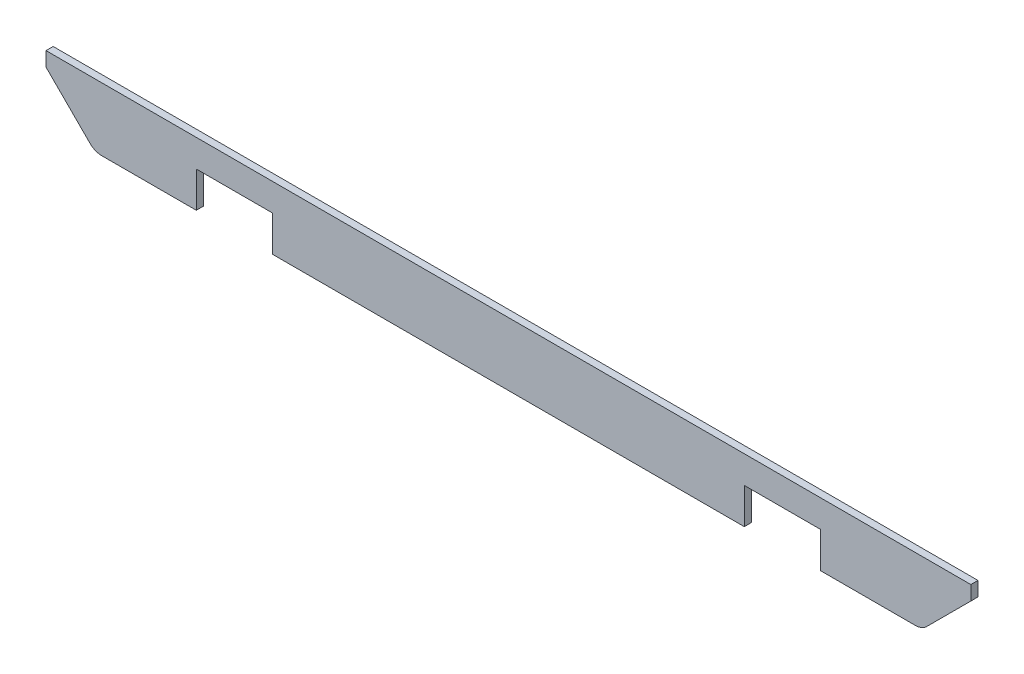
ISO-10303-21;
HEADER;
FILE_DESCRIPTION(('STEP AP214'),'2;1');
FILE_NAME('part.step','',(''),(''),'','','');
FILE_SCHEMA(('AUTOMOTIVE_DESIGN { 1 0 10303 214 1 1 1 1 }'));
ENDSEC;
DATA;
#1=APPLICATION_CONTEXT('core data for automotive mechanical design processes');
#2=APPLICATION_PROTOCOL_DEFINITION('international standard','automotive_design',2000,#1);
#3=PRODUCT_CONTEXT('',#1,'mechanical');
#4=PRODUCT('Part','Part','',(#3));
#5=PRODUCT_RELATED_PRODUCT_CATEGORY('part','',(#4));
#6=PRODUCT_DEFINITION_FORMATION('','',#4);
#7=PRODUCT_DEFINITION_CONTEXT('part definition',#1,'design');
#8=PRODUCT_DEFINITION('design','',#6,#7);
#9=PRODUCT_DEFINITION_SHAPE('','',#8);
#10=(LENGTH_UNIT() NAMED_UNIT(*) SI_UNIT(.MILLI.,.METRE.));
#11=(NAMED_UNIT(*) PLANE_ANGLE_UNIT() SI_UNIT($,.RADIAN.));
#12=(NAMED_UNIT(*) SI_UNIT($,.STERADIAN.) SOLID_ANGLE_UNIT());
#13=UNCERTAINTY_MEASURE_WITH_UNIT(LENGTH_MEASURE(1.E-05),#10,'distance_accuracy_value','');
#14=(GEOMETRIC_REPRESENTATION_CONTEXT(3) GLOBAL_UNCERTAINTY_ASSIGNED_CONTEXT((#13)) GLOBAL_UNIT_ASSIGNED_CONTEXT((#10,
#11,#12)) REPRESENTATION_CONTEXT('',''));
#15=CARTESIAN_POINT('',(0.,0.,0.));
#16=DIRECTION('',(0.,0.,1.));
#17=DIRECTION('',(1.,0.,0.));
#18=AXIS2_PLACEMENT_3D('',#15,#16,#17);
#19=CARTESIAN_POINT('',(-170.604099117637,-19.5020709287023,3.));
#20=DIRECTION('',(0.,0.,-1.));
#21=DIRECTION('',(-1.,0.,0.));
#22=AXIS2_PLACEMENT_3D('',#19,#20,#21);
#23=CYLINDRICAL_SURFACE('',#22,7.00000000000001);
#24=CARTESIAN_POINT('',(-170.604099117637,-19.5020709287023,0.));
#25=DIRECTION('',(0.,0.,1.));
#26=DIRECTION('',(1.,0.,0.));
#27=AXIS2_PLACEMENT_3D('',#24,#25,#26);
#28=CIRCLE('',#27,7.00000000000001);
#29=CARTESIAN_POINT('',(-170.433838396722,-26.5,0.));
#30=VERTEX_POINT('',#29);
#31=CARTESIAN_POINT('',(-175.383585865028,-24.6164141349722,0.));
#32=VERTEX_POINT('',#31);
#33=EDGE_CURVE('E177',#30,#32,#28,.F.);
#34=ORIENTED_EDGE('',*,*,#33,.F.);
#35=DIRECTION('',(0.,0.,-1.));
#36=VECTOR('',#35,1.);
#37=CARTESIAN_POINT('',(-170.433838396722,-26.5,3.));
#38=LINE('',#37,#36);
#39=CARTESIAN_POINT('',(-170.433838396722,-26.5,3.));
#40=VERTEX_POINT('',#39);
#41=EDGE_CURVE('E11',#40,#30,#38,.T.);
#42=ORIENTED_EDGE('',*,*,#41,.F.);
#43=CARTESIAN_POINT('',(-170.604099117637,-19.5020709287023,3.));
#44=DIRECTION('',(0.,0.,1.));
#45=DIRECTION('',(1.,0.,0.));
#46=AXIS2_PLACEMENT_3D('',#43,#44,#45);
#47=CIRCLE('',#46,7.00000000000001);
#48=CARTESIAN_POINT('',(-175.383585865028,-24.6164141349722,3.));
#49=VERTEX_POINT('',#48);
#50=EDGE_CURVE('E217',#40,#49,#47,.F.);
#51=ORIENTED_EDGE('',*,*,#50,.T.);
#52=DIRECTION('',(0.,0.,-1.));
#53=VECTOR('',#52,1.);
#54=CARTESIAN_POINT('',(-175.383585865028,-24.6164141349722,3.));
#55=LINE('',#54,#53);
#56=EDGE_CURVE('E109',#49,#32,#55,.T.);
#57=ORIENTED_EDGE('',*,*,#56,.T.);
#58=EDGE_LOOP('',(#34,#42,#51,#57));
#59=FACE_BOUND('',#58,.T.);
#60=ADVANCED_FACE('F35',(#59),#23,.T.);
#61=CARTESIAN_POINT('',(0.,-26.5,3.));
#62=DIRECTION('',(0.,-1.,0.));
#63=DIRECTION('',(1.,0.,0.));
#64=AXIS2_PLACEMENT_3D('',#61,#62,#63);
#65=PLANE('',#64);
#66=DIRECTION('',(-1.,0.,0.));
#67=VECTOR('',#66,1.);
#68=CARTESIAN_POINT('',(0.,-26.5,0.));
#69=LINE('',#68,#67);
#70=CARTESIAN_POINT('',(-130.955345629466,-26.5,0.));
#71=VERTEX_POINT('',#70);
#72=EDGE_CURVE('E180',#71,#30,#69,.T.);
#73=ORIENTED_EDGE('',*,*,#72,.F.);
#74=DIRECTION('',(0.,0.,-1.));
#75=VECTOR('',#74,1.);
#76=CARTESIAN_POINT('',(-130.955345629466,-26.5,3.));
#77=LINE('',#76,#75);
#78=CARTESIAN_POINT('',(-130.955345629466,-26.5,3.));
#79=VERTEX_POINT('',#78);
#80=EDGE_CURVE('E43',#79,#71,#77,.T.);
#81=ORIENTED_EDGE('',*,*,#80,.F.);
#82=DIRECTION('',(-1.,0.,0.));
#83=VECTOR('',#82,1.);
#84=CARTESIAN_POINT('',(0.,-26.5,3.));
#85=LINE('',#84,#83);
#86=EDGE_CURVE('E257',#79,#40,#85,.T.);
#87=ORIENTED_EDGE('',*,*,#86,.T.);
#88=ORIENTED_EDGE('',*,*,#41,.T.);
#89=EDGE_LOOP('',(#73,#81,#87,#88));
#90=FACE_BOUND('',#89,.T.);
#91=ADVANCED_FACE('F256',(#90),#65,.T.);
#92=CARTESIAN_POINT('',(-130.955345629466,0.,3.));
#93=DIRECTION('',(-1.,0.,0.));
#94=DIRECTION('',(0.,0.,1.));
#95=AXIS2_PLACEMENT_3D('',#92,#93,#94);
#96=PLANE('',#95);
#97=DIRECTION('',(0.,1.,0.));
#98=VECTOR('',#97,1.);
#99=CARTESIAN_POINT('',(-130.955345629466,0.,0.));
#100=LINE('',#99,#98);
#101=CARTESIAN_POINT('',(-130.955345629466,-11.5,0.));
#102=VERTEX_POINT('',#101);
#103=EDGE_CURVE('E183',#71,#102,#100,.T.);
#104=ORIENTED_EDGE('',*,*,#103,.T.);
#105=DIRECTION('',(0.,0.,-1.));
#106=VECTOR('',#105,1.);
#107=CARTESIAN_POINT('',(-130.955345629466,-11.5,3.));
#108=LINE('',#107,#106);
#109=CARTESIAN_POINT('',(-130.955345629466,-11.5,3.));
#110=VERTEX_POINT('',#109);
#111=EDGE_CURVE('E242',#110,#102,#108,.T.);
#112=ORIENTED_EDGE('',*,*,#111,.F.);
#113=DIRECTION('',(0.,1.,0.));
#114=VECTOR('',#113,1.);
#115=CARTESIAN_POINT('',(-130.955345629466,0.,3.));
#116=LINE('',#115,#114);
#117=EDGE_CURVE('E248',#79,#110,#116,.T.);
#118=ORIENTED_EDGE('',*,*,#117,.F.);
#119=ORIENTED_EDGE('',*,*,#80,.T.);
#120=EDGE_LOOP('',(#104,#112,#118,#119));
#121=FACE_BOUND('',#120,.T.);
#122=ADVANCED_FACE('F246',(#121),#96,.F.);
#123=CARTESIAN_POINT('',(0.,-11.5,3.));
#124=DIRECTION('',(0.,-1.,0.));
#125=DIRECTION('',(0.,0.,-1.));
#126=AXIS2_PLACEMENT_3D('',#123,#124,#125);
#127=PLANE('',#126);
#128=DIRECTION('',(-1.,0.,0.));
#129=VECTOR('',#128,1.);
#130=CARTESIAN_POINT('',(0.,-11.5,0.));
#131=LINE('',#130,#129);
#132=CARTESIAN_POINT('',(-98.9553456294655,-11.5,0.));
#133=VERTEX_POINT('',#132);
#134=EDGE_CURVE('E186',#133,#102,#131,.T.);
#135=ORIENTED_EDGE('',*,*,#134,.F.);
#136=DIRECTION('',(0.,0.,-1.));
#137=VECTOR('',#136,1.);
#138=CARTESIAN_POINT('',(-98.9553456294655,-11.5,3.));
#139=LINE('',#138,#137);
#140=CARTESIAN_POINT('',(-98.9553456294655,-11.5,3.));
#141=VERTEX_POINT('',#140);
#142=EDGE_CURVE('E240',#141,#133,#139,.T.);
#143=ORIENTED_EDGE('',*,*,#142,.F.);
#144=DIRECTION('',(-1.,0.,0.));
#145=VECTOR('',#144,1.);
#146=CARTESIAN_POINT('',(0.,-11.5,3.));
#147=LINE('',#146,#145);
#148=EDGE_CURVE('E263',#141,#110,#147,.T.);
#149=ORIENTED_EDGE('',*,*,#148,.T.);
#150=ORIENTED_EDGE('',*,*,#111,.T.);
#151=EDGE_LOOP('',(#135,#143,#149,#150));
#152=FACE_BOUND('',#151,.T.);
#153=ADVANCED_FACE('F314',(#152),#127,.T.);
#154=CARTESIAN_POINT('',(-98.9553456294655,0.,3.));
#155=DIRECTION('',(-1.,0.,0.));
#156=DIRECTION('',(0.,0.,1.));
#157=AXIS2_PLACEMENT_3D('',#154,#155,#156);
#158=PLANE('',#157);
#159=DIRECTION('',(0.,1.,0.));
#160=VECTOR('',#159,1.);
#161=CARTESIAN_POINT('',(-98.9553456294655,0.,0.));
#162=LINE('',#161,#160);
#163=CARTESIAN_POINT('',(-98.9553456294655,-26.5,0.));
#164=VERTEX_POINT('',#163);
#165=EDGE_CURVE('E189',#164,#133,#162,.T.);
#166=ORIENTED_EDGE('',*,*,#165,.F.);
#167=DIRECTION('',(0.,0.,-1.));
#168=VECTOR('',#167,1.);
#169=CARTESIAN_POINT('',(-98.9553456294655,-26.5,3.));
#170=LINE('',#169,#168);
#171=CARTESIAN_POINT('',(-98.9553456294655,-26.5,3.));
#172=VERTEX_POINT('',#171);
#173=EDGE_CURVE('E238',#172,#164,#170,.T.);
#174=ORIENTED_EDGE('',*,*,#173,.F.);
#175=DIRECTION('',(0.,1.,0.));
#176=VECTOR('',#175,1.);
#177=CARTESIAN_POINT('',(-98.9553456294655,0.,3.));
#178=LINE('',#177,#176);
#179=EDGE_CURVE('E266',#172,#141,#178,.T.);
#180=ORIENTED_EDGE('',*,*,#179,.T.);
#181=ORIENTED_EDGE('',*,*,#142,.T.);
#182=EDGE_LOOP('',(#166,#174,#180,#181));
#183=FACE_BOUND('',#182,.T.);
#184=ADVANCED_FACE('F319',(#183),#158,.T.);
#185=CARTESIAN_POINT('',(0.,-26.5,3.));
#186=DIRECTION('',(0.,1.,0.));
#187=DIRECTION('',(0.,0.,1.));
#188=AXIS2_PLACEMENT_3D('',#185,#186,#187);
#189=PLANE('',#188);
#190=DIRECTION('',(1.,0.,0.));
#191=VECTOR('',#190,1.);
#192=CARTESIAN_POINT('',(0.,-26.5,0.));
#193=LINE('',#192,#191);
#194=CARTESIAN_POINT('',(98.9553456294655,-26.5,0.));
#195=VERTEX_POINT('',#194);
#196=EDGE_CURVE('E192',#164,#195,#193,.T.);
#197=ORIENTED_EDGE('',*,*,#196,.T.);
#198=DIRECTION('',(0.,0.,-1.));
#199=VECTOR('',#198,1.);
#200=CARTESIAN_POINT('',(98.9553456294655,-26.5,3.));
#201=LINE('',#200,#199);
#202=CARTESIAN_POINT('',(98.9553456294655,-26.5,3.));
#203=VERTEX_POINT('',#202);
#204=EDGE_CURVE('E235',#203,#195,#201,.T.);
#205=ORIENTED_EDGE('',*,*,#204,.F.);
#206=DIRECTION('',(1.,0.,0.));
#207=VECTOR('',#206,1.);
#208=CARTESIAN_POINT('',(0.,-26.5,3.));
#209=LINE('',#208,#207);
#210=EDGE_CURVE('E269',#172,#203,#209,.T.);
#211=ORIENTED_EDGE('',*,*,#210,.F.);
#212=ORIENTED_EDGE('',*,*,#173,.T.);
#213=EDGE_LOOP('',(#197,#205,#211,#212));
#214=FACE_BOUND('',#213,.T.);
#215=ADVANCED_FACE('F323',(#214),#189,.F.);
#216=CARTESIAN_POINT('',(98.9553456294655,0.,3.));
#217=DIRECTION('',(-1.,0.,0.));
#218=DIRECTION('',(0.,0.,1.));
#219=AXIS2_PLACEMENT_3D('',#216,#217,#218);
#220=PLANE('',#219);
#221=DIRECTION('',(0.,1.,0.));
#222=VECTOR('',#221,1.);
#223=CARTESIAN_POINT('',(98.9553456294655,0.,0.));
#224=LINE('',#223,#222);
#225=CARTESIAN_POINT('',(98.9553456294655,-11.5,0.));
#226=VERTEX_POINT('',#225);
#227=EDGE_CURVE('E194',#195,#226,#224,.T.);
#228=ORIENTED_EDGE('',*,*,#227,.T.);
#229=DIRECTION('',(0.,0.,-1.));
#230=VECTOR('',#229,1.);
#231=CARTESIAN_POINT('',(98.9553456294655,-11.5,3.));
#232=LINE('',#231,#230);
#233=CARTESIAN_POINT('',(98.9553456294655,-11.5,3.));
#234=VERTEX_POINT('',#233);
#235=EDGE_CURVE('E232',#234,#226,#232,.T.);
#236=ORIENTED_EDGE('',*,*,#235,.F.);
#237=DIRECTION('',(0.,1.,0.));
#238=VECTOR('',#237,1.);
#239=CARTESIAN_POINT('',(98.9553456294655,0.,3.));
#240=LINE('',#239,#238);
#241=EDGE_CURVE('E271',#203,#234,#240,.T.);
#242=ORIENTED_EDGE('',*,*,#241,.F.);
#243=ORIENTED_EDGE('',*,*,#204,.T.);
#244=EDGE_LOOP('',(#228,#236,#242,#243));
#245=FACE_BOUND('',#244,.T.);
#246=ADVANCED_FACE('F327',(#245),#220,.F.);
#247=CARTESIAN_POINT('',(0.,-11.5,3.));
#248=DIRECTION('',(0.,1.,0.));
#249=DIRECTION('',(0.,0.,1.));
#250=AXIS2_PLACEMENT_3D('',#247,#248,#249);
#251=PLANE('',#250);
#252=DIRECTION('',(1.,0.,0.));
#253=VECTOR('',#252,1.);
#254=CARTESIAN_POINT('',(0.,-11.5,0.));
#255=LINE('',#254,#253);
#256=CARTESIAN_POINT('',(130.955345629466,-11.5,0.));
#257=VERTEX_POINT('',#256);
#258=EDGE_CURVE('E196',#226,#257,#255,.T.);
#259=ORIENTED_EDGE('',*,*,#258,.T.);
#260=DIRECTION('',(0.,0.,-1.));
#261=VECTOR('',#260,1.);
#262=CARTESIAN_POINT('',(130.955345629466,-11.5,3.));
#263=LINE('',#262,#261);
#264=CARTESIAN_POINT('',(130.955345629466,-11.5,3.));
#265=VERTEX_POINT('',#264);
#266=EDGE_CURVE('E230',#265,#257,#263,.T.);
#267=ORIENTED_EDGE('',*,*,#266,.F.);
#268=DIRECTION('',(1.,0.,0.));
#269=VECTOR('',#268,1.);
#270=CARTESIAN_POINT('',(0.,-11.5,3.));
#271=LINE('',#270,#269);
#272=EDGE_CURVE('E273',#234,#265,#271,.T.);
#273=ORIENTED_EDGE('',*,*,#272,.F.);
#274=ORIENTED_EDGE('',*,*,#235,.T.);
#275=EDGE_LOOP('',(#259,#267,#273,#274));
#276=FACE_BOUND('',#275,.T.);
#277=ADVANCED_FACE('F331',(#276),#251,.F.);
#278=CARTESIAN_POINT('',(130.955345629466,0.,3.));
#279=DIRECTION('',(-1.,0.,0.));
#280=DIRECTION('',(0.,0.,1.));
#281=AXIS2_PLACEMENT_3D('',#278,#279,#280);
#282=PLANE('',#281);
#283=DIRECTION('',(0.,1.,0.));
#284=VECTOR('',#283,1.);
#285=CARTESIAN_POINT('',(130.955345629466,0.,0.));
#286=LINE('',#285,#284);
#287=CARTESIAN_POINT('',(130.955345629466,-26.5,0.));
#288=VERTEX_POINT('',#287);
#289=EDGE_CURVE('E199',#288,#257,#286,.T.);
#290=ORIENTED_EDGE('',*,*,#289,.F.);
#291=DIRECTION('',(0.,0.,-1.));
#292=VECTOR('',#291,1.);
#293=CARTESIAN_POINT('',(130.955345629466,-26.5,3.));
#294=LINE('',#293,#292);
#295=CARTESIAN_POINT('',(130.955345629466,-26.5,3.));
#296=VERTEX_POINT('',#295);
#297=EDGE_CURVE('E228',#296,#288,#294,.T.);
#298=ORIENTED_EDGE('',*,*,#297,.F.);
#299=DIRECTION('',(0.,1.,0.));
#300=VECTOR('',#299,1.);
#301=CARTESIAN_POINT('',(130.955345629466,0.,3.));
#302=LINE('',#301,#300);
#303=EDGE_CURVE('E275',#296,#265,#302,.T.);
#304=ORIENTED_EDGE('',*,*,#303,.T.);
#305=ORIENTED_EDGE('',*,*,#266,.T.);
#306=EDGE_LOOP('',(#290,#298,#304,#305));
#307=FACE_BOUND('',#306,.T.);
#308=ADVANCED_FACE('F335',(#307),#282,.T.);
#309=CARTESIAN_POINT('',(0.,-26.5,3.));
#310=DIRECTION('',(0.,1.,0.));
#311=DIRECTION('',(-1.,0.,0.));
#312=AXIS2_PLACEMENT_3D('',#309,#310,#311);
#313=PLANE('',#312);
#314=DIRECTION('',(1.,0.,0.));
#315=VECTOR('',#314,1.);
#316=CARTESIAN_POINT('',(0.,-26.5,0.));
#317=LINE('',#316,#315);
#318=CARTESIAN_POINT('',(170.433838396722,-26.5,0.));
#319=VERTEX_POINT('',#318);
#320=EDGE_CURVE('E202',#288,#319,#317,.T.);
#321=ORIENTED_EDGE('',*,*,#320,.T.);
#322=DIRECTION('',(0.,0.,-1.));
#323=VECTOR('',#322,1.);
#324=CARTESIAN_POINT('',(170.433838396722,-26.5,3.));
#325=LINE('',#324,#323);
#326=CARTESIAN_POINT('',(170.433838396722,-26.5,3.));
#327=VERTEX_POINT('',#326);
#328=EDGE_CURVE('E225',#327,#319,#325,.T.);
#329=ORIENTED_EDGE('',*,*,#328,.F.);
#330=DIRECTION('',(1.,0.,0.));
#331=VECTOR('',#330,1.);
#332=CARTESIAN_POINT('',(0.,-26.5,3.));
#333=LINE('',#332,#331);
#334=EDGE_CURVE('E278',#296,#327,#333,.T.);
#335=ORIENTED_EDGE('',*,*,#334,.F.);
#336=ORIENTED_EDGE('',*,*,#297,.T.);
#337=EDGE_LOOP('',(#321,#329,#335,#336));
#338=FACE_BOUND('',#337,.T.);
#339=ADVANCED_FACE('F339',(#338),#313,.F.);
#340=CARTESIAN_POINT('',(170.604099117637,-19.5020709287023,3.));
#341=DIRECTION('',(0.,0.,-1.));
#342=DIRECTION('',(-1.,0.,0.));
#343=AXIS2_PLACEMENT_3D('',#340,#341,#342);
#344=CYLINDRICAL_SURFACE('',#343,7.00000000000001);
#345=CARTESIAN_POINT('',(170.604099117637,-19.5020709287023,0.));
#346=DIRECTION('',(0.,0.,1.));
#347=DIRECTION('',(1.,0.,0.));
#348=AXIS2_PLACEMENT_3D('',#345,#346,#347);
#349=CIRCLE('',#348,7.00000000000001);
#350=CARTESIAN_POINT('',(175.383585865028,-24.6164141349722,0.));
#351=VERTEX_POINT('',#350);
#352=EDGE_CURVE('E204',#319,#351,#349,.T.);
#353=ORIENTED_EDGE('',*,*,#352,.T.);
#354=DIRECTION('',(0.,0.,-1.));
#355=VECTOR('',#354,1.);
#356=CARTESIAN_POINT('',(175.383585865028,-24.6164141349722,3.));
#357=LINE('',#356,#355);
#358=CARTESIAN_POINT('',(175.383585865028,-24.6164141349722,3.));
#359=VERTEX_POINT('',#358);
#360=EDGE_CURVE('E223',#359,#351,#357,.T.);
#361=ORIENTED_EDGE('',*,*,#360,.F.);
#362=CARTESIAN_POINT('',(170.604099117637,-19.5020709287023,3.));
#363=DIRECTION('',(0.,0.,1.));
#364=DIRECTION('',(1.,0.,0.));
#365=AXIS2_PLACEMENT_3D('',#362,#363,#364);
#366=CIRCLE('',#365,7.00000000000001);
#367=EDGE_CURVE('E280',#327,#359,#366,.T.);
#368=ORIENTED_EDGE('',*,*,#367,.F.);
#369=ORIENTED_EDGE('',*,*,#328,.T.);
#370=EDGE_LOOP('',(#353,#361,#368,#369));
#371=FACE_BOUND('',#370,.T.);
#372=ADVANCED_FACE('F293',(#371),#344,.T.);
#373=CARTESIAN_POINT('',(100.000000000001,-99.9999999999999,3.));
#374=DIRECTION('',(0.70710678118655,-0.707106781186545,0.));
#375=DIRECTION('',(0.707106781186545,0.70710678118655,0.));
#376=AXIS2_PLACEMENT_3D('',#373,#374,#375);
#377=PLANE('',#376);
#378=DIRECTION('',(-0.707106781186545,-0.70710678118655,0.));
#379=VECTOR('',#378,1.);
#380=CARTESIAN_POINT('',(100.000000000001,-99.9999999999999,0.));
#381=LINE('',#380,#379);
#382=CARTESIAN_POINT('',(194.,-5.99999999999984,0.));
#383=VERTEX_POINT('',#382);
#384=EDGE_CURVE('E207',#383,#351,#381,.T.);
#385=ORIENTED_EDGE('',*,*,#384,.F.);
#386=DIRECTION('',(0.,0.,-1.));
#387=VECTOR('',#386,1.);
#388=CARTESIAN_POINT('',(194.,-5.99999999999984,3.));
#389=LINE('',#388,#387);
#390=CARTESIAN_POINT('',(194.,-5.99999999999984,3.));
#391=VERTEX_POINT('',#390);
#392=EDGE_CURVE('E221',#391,#383,#389,.T.);
#393=ORIENTED_EDGE('',*,*,#392,.F.);
#394=DIRECTION('',(-0.707106781186545,-0.70710678118655,0.));
#395=VECTOR('',#394,1.);
#396=CARTESIAN_POINT('',(100.000000000001,-99.9999999999999,3.));
#397=LINE('',#396,#395);
#398=EDGE_CURVE('E282',#391,#359,#397,.T.);
#399=ORIENTED_EDGE('',*,*,#398,.T.);
#400=ORIENTED_EDGE('',*,*,#360,.T.);
#401=EDGE_LOOP('',(#385,#393,#399,#400));
#402=FACE_BOUND('',#401,.T.);
#403=ADVANCED_FACE('F286',(#402),#377,.T.);
#404=CARTESIAN_POINT('',(194.,-8.97430278238693E-13,3.));
#405=DIRECTION('',(-1.,0.,0.));
#406=DIRECTION('',(0.,-1.,0.));
#407=AXIS2_PLACEMENT_3D('',#404,#405,#406);
#408=PLANE('',#407);
#409=DIRECTION('',(0.,1.,0.));
#410=VECTOR('',#409,1.);
#411=CARTESIAN_POINT('',(194.,-8.97430278238693E-13,0.));
#412=LINE('',#411,#410);
#413=CARTESIAN_POINT('',(194.,0.,0.));
#414=VERTEX_POINT('',#413);
#415=EDGE_CURVE('E210',#383,#414,#412,.T.);
#416=ORIENTED_EDGE('',*,*,#415,.T.);
#417=DIRECTION('',(0.,0.,-1.));
#418=VECTOR('',#417,1.);
#419=CARTESIAN_POINT('',(194.,0.,3.));
#420=LINE('',#419,#418);
#421=CARTESIAN_POINT('',(194.,0.,3.));
#422=VERTEX_POINT('',#421);
#423=EDGE_CURVE('E170',#422,#414,#420,.T.);
#424=ORIENTED_EDGE('',*,*,#423,.F.);
#425=DIRECTION('',(0.,1.,0.));
#426=VECTOR('',#425,1.);
#427=CARTESIAN_POINT('',(194.,-8.97430278238693E-13,3.));
#428=LINE('',#427,#426);
#429=EDGE_CURVE('E157',#391,#422,#428,.T.);
#430=ORIENTED_EDGE('',*,*,#429,.F.);
#431=ORIENTED_EDGE('',*,*,#392,.T.);
#432=EDGE_LOOP('',(#416,#424,#430,#431));
#433=FACE_BOUND('',#432,.T.);
#434=ADVANCED_FACE('F298',(#433),#408,.F.);
#435=CARTESIAN_POINT('',(0.,0.,3.));
#436=DIRECTION('',(0.,-1.,0.));
#437=DIRECTION('',(0.,0.,-1.));
#438=AXIS2_PLACEMENT_3D('',#435,#436,#437);
#439=PLANE('',#438);
#440=DIRECTION('',(-1.,0.,0.));
#441=VECTOR('',#440,1.);
#442=CARTESIAN_POINT('',(0.,0.,0.));
#443=LINE('',#442,#441);
#444=CARTESIAN_POINT('',(-194.,0.,0.));
#445=VERTEX_POINT('',#444);
#446=EDGE_CURVE('E166',#414,#445,#443,.T.);
#447=ORIENTED_EDGE('',*,*,#446,.T.);
#448=DIRECTION('',(0.,0.,-1.));
#449=VECTOR('',#448,1.);
#450=CARTESIAN_POINT('',(-194.,0.,3.));
#451=LINE('',#450,#449);
#452=CARTESIAN_POINT('',(-194.,0.,3.));
#453=VERTEX_POINT('',#452);
#454=EDGE_CURVE('E163',#453,#445,#451,.T.);
#455=ORIENTED_EDGE('',*,*,#454,.F.);
#456=DIRECTION('',(-1.,0.,0.));
#457=VECTOR('',#456,1.);
#458=CARTESIAN_POINT('',(0.,0.,3.));
#459=LINE('',#458,#457);
#460=EDGE_CURVE('E150',#422,#453,#459,.T.);
#461=ORIENTED_EDGE('',*,*,#460,.F.);
#462=ORIENTED_EDGE('',*,*,#423,.T.);
#463=EDGE_LOOP('',(#447,#455,#461,#462));
#464=FACE_BOUND('',#463,.T.);
#465=ADVANCED_FACE('F164',(#464),#439,.F.);
#466=CARTESIAN_POINT('',(-194.,-8.97430278238693E-13,3.));
#467=DIRECTION('',(-1.,0.,0.));
#468=DIRECTION('',(0.,-1.,0.));
#469=AXIS2_PLACEMENT_3D('',#466,#467,#468);
#470=PLANE('',#469);
#471=DIRECTION('',(0.,1.,0.));
#472=VECTOR('',#471,1.);
#473=CARTESIAN_POINT('',(-194.,-8.97430278238693E-13,0.));
#474=LINE('',#473,#472);
#475=CARTESIAN_POINT('',(-194.,-5.99999999999984,0.));
#476=VERTEX_POINT('',#475);
#477=EDGE_CURVE('E213',#476,#445,#474,.T.);
#478=ORIENTED_EDGE('',*,*,#477,.F.);
#479=DIRECTION('',(0.,0.,-1.));
#480=VECTOR('',#479,1.);
#481=CARTESIAN_POINT('',(-194.,-5.99999999999984,3.));
#482=LINE('',#481,#480);
#483=CARTESIAN_POINT('',(-194.,-5.99999999999984,3.));
#484=VERTEX_POINT('',#483);
#485=EDGE_CURVE('E102',#484,#476,#482,.T.);
#486=ORIENTED_EDGE('',*,*,#485,.F.);
#487=DIRECTION('',(0.,1.,0.));
#488=VECTOR('',#487,1.);
#489=CARTESIAN_POINT('',(-194.,-8.97430278238693E-13,3.));
#490=LINE('',#489,#488);
#491=EDGE_CURVE('E154',#484,#453,#490,.T.);
#492=ORIENTED_EDGE('',*,*,#491,.T.);
#493=ORIENTED_EDGE('',*,*,#454,.T.);
#494=EDGE_LOOP('',(#478,#486,#492,#493));
#495=FACE_BOUND('',#494,.T.);
#496=ADVANCED_FACE('F172',(#495),#470,.T.);
#497=CARTESIAN_POINT('',(-100.000000000001,-99.9999999999999,3.));
#498=DIRECTION('',(0.70710678118655,0.707106781186545,0.));
#499=DIRECTION('',(-0.707106781186545,0.70710678118655,0.));
#500=AXIS2_PLACEMENT_3D('',#497,#498,#499);
#501=PLANE('',#500);
#502=DIRECTION('',(0.707106781186545,-0.70710678118655,0.));
#503=VECTOR('',#502,1.);
#504=CARTESIAN_POINT('',(-100.000000000001,-99.9999999999999,0.));
#505=LINE('',#504,#503);
#506=EDGE_CURVE('E215',#476,#32,#505,.T.);
#507=ORIENTED_EDGE('',*,*,#506,.T.);
#508=ORIENTED_EDGE('',*,*,#56,.F.);
#509=DIRECTION('',(0.707106781186545,-0.70710678118655,0.));
#510=VECTOR('',#509,1.);
#511=CARTESIAN_POINT('',(-100.000000000001,-99.9999999999999,3.));
#512=LINE('',#511,#510);
#513=EDGE_CURVE('E51',#484,#49,#512,.T.);
#514=ORIENTED_EDGE('',*,*,#513,.F.);
#515=ORIENTED_EDGE('',*,*,#485,.T.);
#516=EDGE_LOOP('',(#507,#508,#514,#515));
#517=FACE_BOUND('',#516,.T.);
#518=ADVANCED_FACE('F258',(#517),#501,.F.);
#519=CARTESIAN_POINT('',(0.,0.,3.));
#520=DIRECTION('',(0.,0.,1.));
#521=DIRECTION('',(1.,0.,0.));
#522=AXIS2_PLACEMENT_3D('',#519,#520,#521);
#523=PLANE('',#522);
#524=ORIENTED_EDGE('',*,*,#50,.F.);
#525=ORIENTED_EDGE('',*,*,#86,.F.);
#526=ORIENTED_EDGE('',*,*,#117,.T.);
#527=ORIENTED_EDGE('',*,*,#148,.F.);
#528=ORIENTED_EDGE('',*,*,#179,.F.);
#529=ORIENTED_EDGE('',*,*,#210,.T.);
#530=ORIENTED_EDGE('',*,*,#241,.T.);
#531=ORIENTED_EDGE('',*,*,#272,.T.);
#532=ORIENTED_EDGE('',*,*,#303,.F.);
#533=ORIENTED_EDGE('',*,*,#334,.T.);
#534=ORIENTED_EDGE('',*,*,#367,.T.);
#535=ORIENTED_EDGE('',*,*,#398,.F.);
#536=ORIENTED_EDGE('',*,*,#429,.T.);
#537=ORIENTED_EDGE('',*,*,#460,.T.);
#538=ORIENTED_EDGE('',*,*,#491,.F.);
#539=ORIENTED_EDGE('',*,*,#513,.T.);
#540=EDGE_LOOP('',(#524,#525,#526,#527,#528,#529,#530,#531,#532,#533,#534,#535,#536,#537,#538,#539));
#541=FACE_BOUND('',#540,.T.);
#542=ADVANCED_FACE('F152',(#541),#523,.T.);
#543=CARTESIAN_POINT('',(0.,0.,0.));
#544=DIRECTION('',(0.,0.,1.));
#545=DIRECTION('',(1.,0.,0.));
#546=AXIS2_PLACEMENT_3D('',#543,#544,#545);
#547=PLANE('',#546);
#548=ORIENTED_EDGE('',*,*,#33,.T.);
#549=ORIENTED_EDGE('',*,*,#506,.F.);
#550=ORIENTED_EDGE('',*,*,#477,.T.);
#551=ORIENTED_EDGE('',*,*,#446,.F.);
#552=ORIENTED_EDGE('',*,*,#415,.F.);
#553=ORIENTED_EDGE('',*,*,#384,.T.);
#554=ORIENTED_EDGE('',*,*,#352,.F.);
#555=ORIENTED_EDGE('',*,*,#320,.F.);
#556=ORIENTED_EDGE('',*,*,#289,.T.);
#557=ORIENTED_EDGE('',*,*,#258,.F.);
#558=ORIENTED_EDGE('',*,*,#227,.F.);
#559=ORIENTED_EDGE('',*,*,#196,.F.);
#560=ORIENTED_EDGE('',*,*,#165,.T.);
#561=ORIENTED_EDGE('',*,*,#134,.T.);
#562=ORIENTED_EDGE('',*,*,#103,.F.);
#563=ORIENTED_EDGE('',*,*,#72,.T.);
#564=EDGE_LOOP('',(#548,#549,#550,#551,#552,#553,#554,#555,#556,#557,#558,#559,#560,#561,#562,#563));
#565=FACE_BOUND('',#564,.T.);
#566=ADVANCED_FACE('F254',(#565),#547,.F.);
#567=CLOSED_SHELL('',(#60,#91,#122,#153,#184,#215,#246,#277,#308,#339,#372,#403,#434,#465,#496,
#518,#542,#566));
#568=MANIFOLD_SOLID_BREP('B2',#567);
#569=ADVANCED_BREP_SHAPE_REPRESENTATION('',(#18,#568),#14);
#570=SHAPE_DEFINITION_REPRESENTATION(#9,#569);
ENDSEC;
END-ISO-10303-21;
